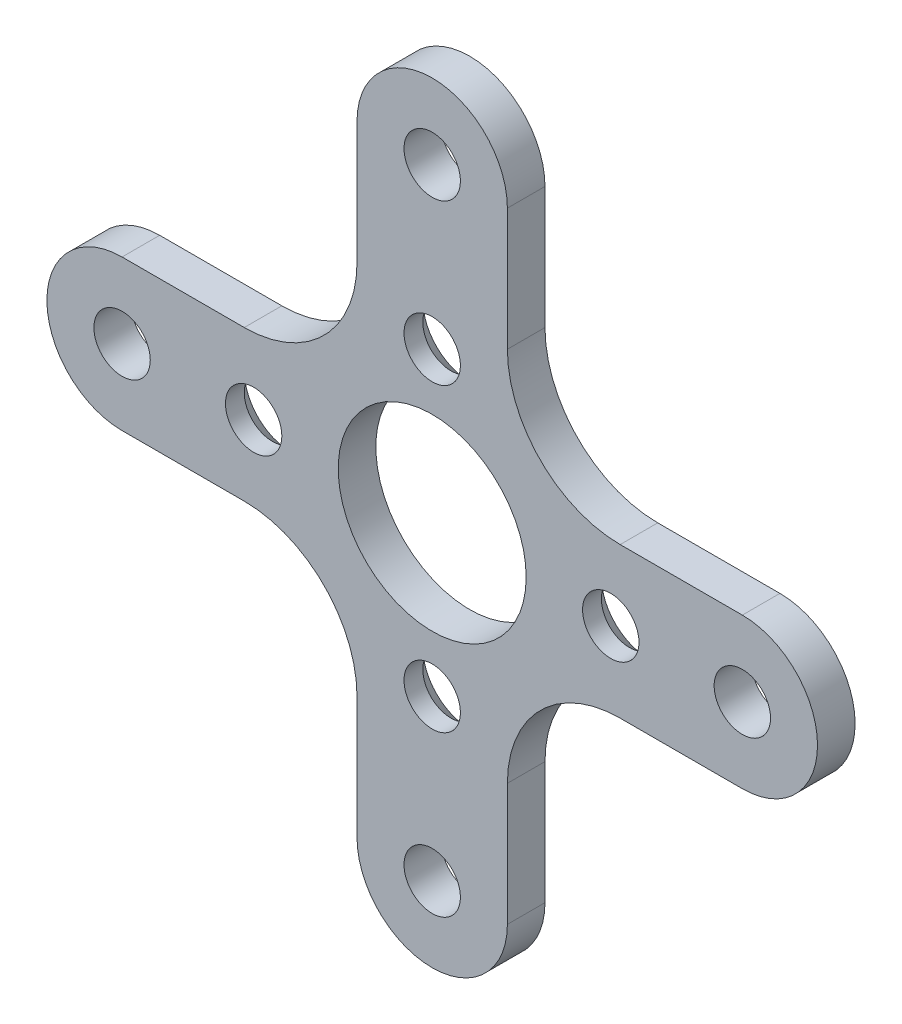
ISO-10303-21;
HEADER;
FILE_DESCRIPTION(('STEP AP214'),'2;1');
FILE_NAME('part.step','',(''),(''),'','','');
FILE_SCHEMA(('AUTOMOTIVE_DESIGN { 1 0 10303 214 1 1 1 1 }'));
ENDSEC;
DATA;
#1=APPLICATION_CONTEXT('core data for automotive mechanical design processes');
#2=APPLICATION_PROTOCOL_DEFINITION('international standard','automotive_design',2000,#1);
#3=PRODUCT_CONTEXT('',#1,'mechanical');
#4=PRODUCT('Part','Part','',(#3));
#5=PRODUCT_RELATED_PRODUCT_CATEGORY('part','',(#4));
#6=PRODUCT_DEFINITION_FORMATION('','',#4);
#7=PRODUCT_DEFINITION_CONTEXT('part definition',#1,'design');
#8=PRODUCT_DEFINITION('design','',#6,#7);
#9=PRODUCT_DEFINITION_SHAPE('','',#8);
#10=(LENGTH_UNIT() NAMED_UNIT(*) SI_UNIT(.MILLI.,.METRE.));
#11=(NAMED_UNIT(*) PLANE_ANGLE_UNIT() SI_UNIT($,.RADIAN.));
#12=(NAMED_UNIT(*) SI_UNIT($,.STERADIAN.) SOLID_ANGLE_UNIT());
#13=UNCERTAINTY_MEASURE_WITH_UNIT(LENGTH_MEASURE(1.E-05),#10,'distance_accuracy_value','');
#14=(GEOMETRIC_REPRESENTATION_CONTEXT(3) GLOBAL_UNCERTAINTY_ASSIGNED_CONTEXT((#13)) GLOBAL_UNIT_ASSIGNED_CONTEXT((#10,
#11,#12)) REPRESENTATION_CONTEXT('',''));
#15=CARTESIAN_POINT('',(0.,0.,0.));
#16=DIRECTION('',(0.,0.,1.));
#17=DIRECTION('',(1.,0.,0.));
#18=AXIS2_PLACEMENT_3D('',#15,#16,#17);
#19=CARTESIAN_POINT('',(0.,16.5,2.));
#20=DIRECTION('',(0.,0.,1.));
#21=DIRECTION('',(1.,0.,0.));
#22=AXIS2_PLACEMENT_3D('',#19,#20,#21);
#23=PLANE('',#22);
#24=CARTESIAN_POINT('',(0.,0.,2.));
#25=DIRECTION('',(0.,0.,1.));
#26=DIRECTION('',(1.,0.,0.));
#27=AXIS2_PLACEMENT_3D('',#24,#25,#26);
#28=CIRCLE('',#27,5.);
#29=CARTESIAN_POINT('',(5.,0.,2.));
#30=VERTEX_POINT('',#29);
#31=EDGE_CURVE('E318',#30,#30,#28,.T.);
#32=ORIENTED_EDGE('',*,*,#31,.F.);
#33=EDGE_LOOP('',(#32));
#34=FACE_BOUND('',#33,.T.);
#35=CARTESIAN_POINT('',(6.94421116492479E-07,-16.5000006944211,2.));
#36=DIRECTION('',(0.,0.,1.));
#37=DIRECTION('',(1.,0.,0.));
#38=AXIS2_PLACEMENT_3D('',#35,#36,#37);
#39=CIRCLE('',#38,1.5);
#40=CARTESIAN_POINT('',(1.50000069442112,-16.5000006944211,2.));
#41=VERTEX_POINT('',#40);
#42=EDGE_CURVE('E325',#41,#41,#39,.T.);
#43=ORIENTED_EDGE('',*,*,#42,.F.);
#44=EDGE_LOOP('',(#43));
#45=FACE_BOUND('',#44,.T.);
#46=CARTESIAN_POINT('',(6.94421115451529E-07,-8.00000069442111,2.));
#47=DIRECTION('',(0.,0.,1.));
#48=DIRECTION('',(1.,0.,0.));
#49=AXIS2_PLACEMENT_3D('',#46,#47,#48);
#50=CIRCLE('',#49,1.5);
#51=CARTESIAN_POINT('',(1.50000069442112,-8.00000069442111,2.));
#52=VERTEX_POINT('',#51);
#53=EDGE_CURVE('E332',#52,#52,#50,.T.);
#54=ORIENTED_EDGE('',*,*,#53,.F.);
#55=EDGE_LOOP('',(#54));
#56=FACE_BOUND('',#55,.T.);
#57=CARTESIAN_POINT('',(9.5,-6.94421114038756E-07,2.));
#58=DIRECTION('',(0.,0.,1.));
#59=DIRECTION('',(1.,0.,0.));
#60=AXIS2_PLACEMENT_3D('',#57,#58,#59);
#61=CIRCLE('',#60,1.5);
#62=CARTESIAN_POINT('',(11.,-6.94421114038756E-07,2.));
#63=VERTEX_POINT('',#62);
#64=EDGE_CURVE('E339',#63,#63,#61,.T.);
#65=ORIENTED_EDGE('',*,*,#64,.F.);
#66=EDGE_LOOP('',(#65));
#67=FACE_BOUND('',#66,.T.);
#68=CARTESIAN_POINT('',(0.,16.5,2.));
#69=DIRECTION('',(0.,0.,1.));
#70=DIRECTION('',(1.,0.,0.));
#71=AXIS2_PLACEMENT_3D('',#68,#69,#70);
#72=CIRCLE('',#71,4.);
#73=CARTESIAN_POINT('',(4.,16.5,2.));
#74=VERTEX_POINT('',#73);
#75=CARTESIAN_POINT('',(-4.,16.5,2.));
#76=VERTEX_POINT('',#75);
#77=EDGE_CURVE('E215',#74,#76,#72,.T.);
#78=ORIENTED_EDGE('',*,*,#77,.T.);
#79=DIRECTION('',(0.,-1.,0.));
#80=VECTOR('',#79,1.);
#81=CARTESIAN_POINT('',(-4.,10.,2.));
#82=LINE('',#81,#80);
#83=CARTESIAN_POINT('',(-4.,10.,2.));
#84=VERTEX_POINT('',#83);
#85=EDGE_CURVE('E123',#76,#84,#82,.T.);
#86=ORIENTED_EDGE('',*,*,#85,.T.);
#87=CARTESIAN_POINT('',(-10.,9.99999930557889,2.));
#88=DIRECTION('',(0.,0.,-1.));
#89=DIRECTION('',(1.,0.,0.));
#90=AXIS2_PLACEMENT_3D('',#87,#88,#89);
#91=CIRCLE('',#90,6.00000000000002);
#92=CARTESIAN_POINT('',(-10.,3.99999930557887,2.));
#93=VERTEX_POINT('',#92);
#94=EDGE_CURVE('E347',#84,#93,#91,.T.);
#95=ORIENTED_EDGE('',*,*,#94,.T.);
#96=DIRECTION('',(-1.,0.,0.));
#97=VECTOR('',#96,1.);
#98=CARTESIAN_POINT('',(-10.,3.99999930557889,2.));
#99=LINE('',#98,#97);
#100=CARTESIAN_POINT('',(-16.5,3.99999930557889,2.));
#101=VERTEX_POINT('',#100);
#102=EDGE_CURVE('E349',#93,#101,#99,.T.);
#103=ORIENTED_EDGE('',*,*,#102,.T.);
#104=CARTESIAN_POINT('',(-16.5,-6.94421114040816E-07,2.));
#105=DIRECTION('',(0.,0.,1.));
#106=DIRECTION('',(1.,0.,0.));
#107=AXIS2_PLACEMENT_3D('',#104,#105,#106);
#108=CIRCLE('',#107,4.);
#109=CARTESIAN_POINT('',(-16.5,-4.00000069442111,2.));
#110=VERTEX_POINT('',#109);
#111=EDGE_CURVE('E351',#101,#110,#108,.T.);
#112=ORIENTED_EDGE('',*,*,#111,.T.);
#113=DIRECTION('',(1.,0.,0.));
#114=VECTOR('',#113,1.);
#115=CARTESIAN_POINT('',(-10.,-4.00000069442111,2.));
#116=LINE('',#115,#114);
#117=CARTESIAN_POINT('',(-10.,-4.00000069442111,2.));
#118=VERTEX_POINT('',#117);
#119=EDGE_CURVE('E353',#110,#118,#116,.T.);
#120=ORIENTED_EDGE('',*,*,#119,.T.);
#121=CARTESIAN_POINT('',(-9.99999930557889,-10.0000006944211,2.));
#122=DIRECTION('',(0.,0.,-1.));
#123=DIRECTION('',(1.,0.,0.));
#124=AXIS2_PLACEMENT_3D('',#121,#122,#123);
#125=CIRCLE('',#124,6.00000000000002);
#126=CARTESIAN_POINT('',(-3.99999930557887,-10.0000006944211,2.));
#127=VERTEX_POINT('',#126);
#128=EDGE_CURVE('E355',#118,#127,#125,.T.);
#129=ORIENTED_EDGE('',*,*,#128,.T.);
#130=DIRECTION('',(0.,-1.,0.));
#131=VECTOR('',#130,1.);
#132=CARTESIAN_POINT('',(-3.99999930557889,-10.0000006944211,2.));
#133=LINE('',#132,#131);
#134=CARTESIAN_POINT('',(-3.99999930557888,-16.5000006944211,2.));
#135=VERTEX_POINT('',#134);
#136=EDGE_CURVE('E357',#127,#135,#133,.T.);
#137=ORIENTED_EDGE('',*,*,#136,.T.);
#138=CARTESIAN_POINT('',(6.94421116492479E-07,-16.5000006944211,2.));
#139=DIRECTION('',(0.,0.,1.));
#140=DIRECTION('',(1.,0.,0.));
#141=AXIS2_PLACEMENT_3D('',#138,#139,#140);
#142=CIRCLE('',#141,4.);
#143=CARTESIAN_POINT('',(4.00000069442112,-16.5000006944211,2.));
#144=VERTEX_POINT('',#143);
#145=EDGE_CURVE('E359',#135,#144,#142,.T.);
#146=ORIENTED_EDGE('',*,*,#145,.T.);
#147=DIRECTION('',(0.,1.,0.));
#148=VECTOR('',#147,1.);
#149=CARTESIAN_POINT('',(4.00000069442113,-10.0000006944211,2.));
#150=LINE('',#149,#148);
#151=CARTESIAN_POINT('',(4.00000069442113,-10.0000006944211,2.));
#152=VERTEX_POINT('',#151);
#153=EDGE_CURVE('E361',#144,#152,#150,.T.);
#154=ORIENTED_EDGE('',*,*,#153,.T.);
#155=CARTESIAN_POINT('',(10.0000006944211,-10.,2.));
#156=DIRECTION('',(0.,0.,-1.));
#157=DIRECTION('',(1.,0.,0.));
#158=AXIS2_PLACEMENT_3D('',#155,#156,#157);
#159=CIRCLE('',#158,6.00000000000002);
#160=CARTESIAN_POINT('',(10.0000006944211,-3.99999999999998,2.));
#161=VERTEX_POINT('',#160);
#162=EDGE_CURVE('E363',#152,#161,#159,.T.);
#163=ORIENTED_EDGE('',*,*,#162,.T.);
#164=DIRECTION('',(1.,0.,0.));
#165=VECTOR('',#164,1.);
#166=CARTESIAN_POINT('',(10.0000006944211,-4.,2.));
#167=LINE('',#166,#165);
#168=CARTESIAN_POINT('',(16.5000006944211,-4.,2.));
#169=VERTEX_POINT('',#168);
#170=EDGE_CURVE('E365',#161,#169,#167,.T.);
#171=ORIENTED_EDGE('',*,*,#170,.T.);
#172=CARTESIAN_POINT('',(16.5000003472106,0.,2.));
#173=DIRECTION('',(0.,0.,1.));
#174=DIRECTION('',(1.,0.,0.));
#175=AXIS2_PLACEMENT_3D('',#172,#173,#174);
#176=CIRCLE('',#175,4.00000000000002);
#177=CARTESIAN_POINT('',(16.5,4.00000000000001,2.));
#178=VERTEX_POINT('',#177);
#179=EDGE_CURVE('E166',#169,#178,#176,.T.);
#180=ORIENTED_EDGE('',*,*,#179,.T.);
#181=DIRECTION('',(-1.,0.,0.));
#182=VECTOR('',#181,1.);
#183=CARTESIAN_POINT('',(10.,4.00000000000001,2.));
#184=LINE('',#183,#182);
#185=CARTESIAN_POINT('',(10.,4.00000000000001,2.));
#186=VERTEX_POINT('',#185);
#187=EDGE_CURVE('E160',#178,#186,#184,.T.);
#188=ORIENTED_EDGE('',*,*,#187,.T.);
#189=CARTESIAN_POINT('',(10.,10.,2.));
#190=DIRECTION('',(0.,0.,-1.));
#191=DIRECTION('',(1.,0.,0.));
#192=AXIS2_PLACEMENT_3D('',#189,#190,#191);
#193=CIRCLE('',#192,6.);
#194=CARTESIAN_POINT('',(4.,10.,2.));
#195=VERTEX_POINT('',#194);
#196=EDGE_CURVE('E164',#186,#195,#193,.T.);
#197=ORIENTED_EDGE('',*,*,#196,.T.);
#198=DIRECTION('',(0.,1.,0.));
#199=VECTOR('',#198,1.);
#200=CARTESIAN_POINT('',(4.,10.,2.));
#201=LINE('',#200,#199);
#202=EDGE_CURVE('E55',#195,#74,#201,.T.);
#203=ORIENTED_EDGE('',*,*,#202,.T.);
#204=EDGE_LOOP('',(#78,#86,#95,#103,#112,#120,#129,#137,#146,#154,#163,#171,#180,#188,#197,#203));
#205=FACE_BOUND('',#204,.T.);
#206=CARTESIAN_POINT('',(0.,8.,2.));
#207=DIRECTION('',(0.,0.,1.));
#208=DIRECTION('',(1.,0.,0.));
#209=AXIS2_PLACEMENT_3D('',#206,#207,#208);
#210=CIRCLE('',#209,1.5);
#211=CARTESIAN_POINT('',(1.5,8.,2.));
#212=VERTEX_POINT('',#211);
#213=EDGE_CURVE('E188',#212,#212,#210,.T.);
#214=ORIENTED_EDGE('',*,*,#213,.F.);
#215=EDGE_LOOP('',(#214));
#216=FACE_BOUND('',#215,.T.);
#217=CARTESIAN_POINT('',(16.5000003472106,0.,2.));
#218=DIRECTION('',(0.,0.,1.));
#219=DIRECTION('',(1.,0.,0.));
#220=AXIS2_PLACEMENT_3D('',#217,#218,#219);
#221=CIRCLE('',#220,1.5);
#222=CARTESIAN_POINT('',(18.0000003472106,0.,2.));
#223=VERTEX_POINT('',#222);
#224=EDGE_CURVE('E336',#223,#223,#221,.T.);
#225=ORIENTED_EDGE('',*,*,#224,.F.);
#226=EDGE_LOOP('',(#225));
#227=FACE_BOUND('',#226,.T.);
#228=CARTESIAN_POINT('',(0.,16.5,2.));
#229=DIRECTION('',(0.,0.,1.));
#230=DIRECTION('',(1.,0.,0.));
#231=AXIS2_PLACEMENT_3D('',#228,#229,#230);
#232=CIRCLE('',#231,1.5);
#233=CARTESIAN_POINT('',(1.5,16.5,2.));
#234=VERTEX_POINT('',#233);
#235=EDGE_CURVE('E329',#234,#234,#232,.T.);
#236=ORIENTED_EDGE('',*,*,#235,.F.);
#237=EDGE_LOOP('',(#236));
#238=FACE_BOUND('',#237,.T.);
#239=CARTESIAN_POINT('',(-9.5,-6.94421114038756E-07,2.));
#240=DIRECTION('',(0.,0.,1.));
#241=DIRECTION('',(1.,0.,0.));
#242=AXIS2_PLACEMENT_3D('',#239,#240,#241);
#243=CIRCLE('',#242,1.5);
#244=CARTESIAN_POINT('',(-8.,-6.94421114038756E-07,2.));
#245=VERTEX_POINT('',#244);
#246=EDGE_CURVE('E321',#245,#245,#243,.T.);
#247=ORIENTED_EDGE('',*,*,#246,.F.);
#248=EDGE_LOOP('',(#247));
#249=FACE_BOUND('',#248,.T.);
#250=CARTESIAN_POINT('',(-16.5,-6.94421114040816E-07,2.));
#251=DIRECTION('',(0.,0.,1.));
#252=DIRECTION('',(1.,0.,0.));
#253=AXIS2_PLACEMENT_3D('',#250,#251,#252);
#254=CIRCLE('',#253,1.5);
#255=CARTESIAN_POINT('',(-15.,-6.94421114040816E-07,2.));
#256=VERTEX_POINT('',#255);
#257=EDGE_CURVE('E313',#256,#256,#254,.T.);
#258=ORIENTED_EDGE('',*,*,#257,.F.);
#259=EDGE_LOOP('',(#258));
#260=FACE_BOUND('',#259,.T.);
#261=ADVANCED_FACE('F37',(#34,#45,#56,#67,#205,#216,#227,#238,#249,#260),#23,.T.);
#262=CARTESIAN_POINT('',(0.,16.5,0.));
#263=DIRECTION('',(0.,0.,1.));
#264=DIRECTION('',(1.,0.,0.));
#265=AXIS2_PLACEMENT_3D('',#262,#263,#264);
#266=PLANE('',#265);
#267=CARTESIAN_POINT('',(6.94421115451529E-07,-8.00000069442111,0.));
#268=DIRECTION('',(0.,0.,1.));
#269=DIRECTION('',(1.,0.,0.));
#270=AXIS2_PLACEMENT_3D('',#267,#268,#269);
#271=CIRCLE('',#270,2.5);
#272=CARTESIAN_POINT('',(2.50000069442111,-8.00000069442111,0.));
#273=VERTEX_POINT('',#272);
#274=EDGE_CURVE('E263',#273,#273,#271,.T.);
#275=ORIENTED_EDGE('',*,*,#274,.T.);
#276=EDGE_LOOP('',(#275));
#277=FACE_BOUND('',#276,.T.);
#278=CARTESIAN_POINT('',(-9.5,-6.94421114038756E-07,0.));
#279=DIRECTION('',(0.,0.,1.));
#280=DIRECTION('',(1.,0.,0.));
#281=AXIS2_PLACEMENT_3D('',#278,#279,#280);
#282=CIRCLE('',#281,2.5);
#283=CARTESIAN_POINT('',(-7.,-6.94421114038756E-07,0.));
#284=VERTEX_POINT('',#283);
#285=EDGE_CURVE('E260',#284,#284,#282,.T.);
#286=ORIENTED_EDGE('',*,*,#285,.T.);
#287=EDGE_LOOP('',(#286));
#288=FACE_BOUND('',#287,.T.);
#289=CARTESIAN_POINT('',(0.,8.,0.));
#290=DIRECTION('',(0.,0.,1.));
#291=DIRECTION('',(1.,0.,0.));
#292=AXIS2_PLACEMENT_3D('',#289,#290,#291);
#293=CIRCLE('',#292,2.5);
#294=CARTESIAN_POINT('',(2.5,8.,0.));
#295=VERTEX_POINT('',#294);
#296=EDGE_CURVE('E257',#295,#295,#293,.T.);
#297=ORIENTED_EDGE('',*,*,#296,.T.);
#298=EDGE_LOOP('',(#297));
#299=FACE_BOUND('',#298,.T.);
#300=CARTESIAN_POINT('',(9.5,-6.94421114038756E-07,0.));
#301=DIRECTION('',(0.,0.,1.));
#302=DIRECTION('',(1.,0.,0.));
#303=AXIS2_PLACEMENT_3D('',#300,#301,#302);
#304=CIRCLE('',#303,2.5);
#305=CARTESIAN_POINT('',(12.,-6.94421114038756E-07,0.));
#306=VERTEX_POINT('',#305);
#307=EDGE_CURVE('E254',#306,#306,#304,.T.);
#308=ORIENTED_EDGE('',*,*,#307,.T.);
#309=EDGE_LOOP('',(#308));
#310=FACE_BOUND('',#309,.T.);
#311=CARTESIAN_POINT('',(0.,16.5,0.));
#312=DIRECTION('',(0.,0.,1.));
#313=DIRECTION('',(1.,0.,0.));
#314=AXIS2_PLACEMENT_3D('',#311,#312,#313);
#315=CIRCLE('',#314,4.);
#316=CARTESIAN_POINT('',(4.,16.5,0.));
#317=VERTEX_POINT('',#316);
#318=CARTESIAN_POINT('',(-4.,16.5,0.));
#319=VERTEX_POINT('',#318);
#320=EDGE_CURVE('E184',#317,#319,#315,.T.);
#321=ORIENTED_EDGE('',*,*,#320,.F.);
#322=DIRECTION('',(0.,1.,0.));
#323=VECTOR('',#322,1.);
#324=CARTESIAN_POINT('',(4.,10.,0.));
#325=LINE('',#324,#323);
#326=CARTESIAN_POINT('',(4.,10.,0.));
#327=VERTEX_POINT('',#326);
#328=EDGE_CURVE('E114',#327,#317,#325,.T.);
#329=ORIENTED_EDGE('',*,*,#328,.F.);
#330=CARTESIAN_POINT('',(10.,10.,0.));
#331=DIRECTION('',(0.,0.,-1.));
#332=DIRECTION('',(1.,0.,0.));
#333=AXIS2_PLACEMENT_3D('',#330,#331,#332);
#334=CIRCLE('',#333,6.);
#335=CARTESIAN_POINT('',(10.,4.00000000000001,0.));
#336=VERTEX_POINT('',#335);
#337=EDGE_CURVE('E108',#336,#327,#334,.T.);
#338=ORIENTED_EDGE('',*,*,#337,.F.);
#339=DIRECTION('',(-1.,0.,0.));
#340=VECTOR('',#339,1.);
#341=CARTESIAN_POINT('',(10.,4.00000000000001,0.));
#342=LINE('',#341,#340);
#343=CARTESIAN_POINT('',(16.5,4.00000000000001,0.));
#344=VERTEX_POINT('',#343);
#345=EDGE_CURVE('E174',#344,#336,#342,.T.);
#346=ORIENTED_EDGE('',*,*,#345,.F.);
#347=CARTESIAN_POINT('',(16.5000003472106,0.,0.));
#348=DIRECTION('',(0.,0.,1.));
#349=DIRECTION('',(1.,0.,0.));
#350=AXIS2_PLACEMENT_3D('',#347,#348,#349);
#351=CIRCLE('',#350,4.00000000000002);
#352=CARTESIAN_POINT('',(16.5000006944211,-4.,0.));
#353=VERTEX_POINT('',#352);
#354=EDGE_CURVE('E210',#353,#344,#351,.T.);
#355=ORIENTED_EDGE('',*,*,#354,.F.);
#356=DIRECTION('',(1.,0.,0.));
#357=VECTOR('',#356,1.);
#358=CARTESIAN_POINT('',(10.0000006944211,-4.,0.));
#359=LINE('',#358,#357);
#360=CARTESIAN_POINT('',(10.0000006944211,-3.99999999999998,0.));
#361=VERTEX_POINT('',#360);
#362=EDGE_CURVE('E208',#361,#353,#359,.T.);
#363=ORIENTED_EDGE('',*,*,#362,.F.);
#364=CARTESIAN_POINT('',(10.0000006944211,-10.,0.));
#365=DIRECTION('',(0.,0.,-1.));
#366=DIRECTION('',(1.,0.,0.));
#367=AXIS2_PLACEMENT_3D('',#364,#365,#366);
#368=CIRCLE('',#367,6.00000000000002);
#369=CARTESIAN_POINT('',(4.00000069442113,-10.0000006944211,0.));
#370=VERTEX_POINT('',#369);
#371=EDGE_CURVE('E206',#370,#361,#368,.T.);
#372=ORIENTED_EDGE('',*,*,#371,.F.);
#373=DIRECTION('',(0.,1.,0.));
#374=VECTOR('',#373,1.);
#375=CARTESIAN_POINT('',(4.00000069442113,-10.0000006944211,0.));
#376=LINE('',#375,#374);
#377=CARTESIAN_POINT('',(4.00000069442112,-16.5000006944211,0.));
#378=VERTEX_POINT('',#377);
#379=EDGE_CURVE('E204',#378,#370,#376,.T.);
#380=ORIENTED_EDGE('',*,*,#379,.F.);
#381=CARTESIAN_POINT('',(6.94421116492479E-07,-16.5000006944211,0.));
#382=DIRECTION('',(0.,0.,1.));
#383=DIRECTION('',(1.,0.,0.));
#384=AXIS2_PLACEMENT_3D('',#381,#382,#383);
#385=CIRCLE('',#384,4.);
#386=CARTESIAN_POINT('',(-3.99999930557888,-16.5000006944211,0.));
#387=VERTEX_POINT('',#386);
#388=EDGE_CURVE('E202',#387,#378,#385,.T.);
#389=ORIENTED_EDGE('',*,*,#388,.F.);
#390=DIRECTION('',(0.,-1.,0.));
#391=VECTOR('',#390,1.);
#392=CARTESIAN_POINT('',(-3.99999930557889,-10.0000006944211,0.));
#393=LINE('',#392,#391);
#394=CARTESIAN_POINT('',(-3.99999930557887,-10.0000006944211,0.));
#395=VERTEX_POINT('',#394);
#396=EDGE_CURVE('E200',#395,#387,#393,.T.);
#397=ORIENTED_EDGE('',*,*,#396,.F.);
#398=CARTESIAN_POINT('',(-9.99999930557889,-10.0000006944211,0.));
#399=DIRECTION('',(0.,0.,-1.));
#400=DIRECTION('',(1.,0.,0.));
#401=AXIS2_PLACEMENT_3D('',#398,#399,#400);
#402=CIRCLE('',#401,6.00000000000002);
#403=CARTESIAN_POINT('',(-10.,-4.00000069442111,0.));
#404=VERTEX_POINT('',#403);
#405=EDGE_CURVE('E198',#404,#395,#402,.T.);
#406=ORIENTED_EDGE('',*,*,#405,.F.);
#407=DIRECTION('',(1.,0.,0.));
#408=VECTOR('',#407,1.);
#409=CARTESIAN_POINT('',(-10.,-4.00000069442111,0.));
#410=LINE('',#409,#408);
#411=CARTESIAN_POINT('',(-16.5,-4.00000069442111,0.));
#412=VERTEX_POINT('',#411);
#413=EDGE_CURVE('E196',#412,#404,#410,.T.);
#414=ORIENTED_EDGE('',*,*,#413,.F.);
#415=CARTESIAN_POINT('',(-16.5,-6.94421114040816E-07,0.));
#416=DIRECTION('',(0.,0.,1.));
#417=DIRECTION('',(1.,0.,0.));
#418=AXIS2_PLACEMENT_3D('',#415,#416,#417);
#419=CIRCLE('',#418,4.);
#420=CARTESIAN_POINT('',(-16.5,3.99999930557889,0.));
#421=VERTEX_POINT('',#420);
#422=EDGE_CURVE('E194',#421,#412,#419,.T.);
#423=ORIENTED_EDGE('',*,*,#422,.F.);
#424=DIRECTION('',(-1.,0.,0.));
#425=VECTOR('',#424,1.);
#426=CARTESIAN_POINT('',(-10.,3.99999930557889,0.));
#427=LINE('',#426,#425);
#428=CARTESIAN_POINT('',(-10.,3.99999930557887,0.));
#429=VERTEX_POINT('',#428);
#430=EDGE_CURVE('E192',#429,#421,#427,.T.);
#431=ORIENTED_EDGE('',*,*,#430,.F.);
#432=CARTESIAN_POINT('',(-10.,9.99999930557889,0.));
#433=DIRECTION('',(0.,0.,-1.));
#434=DIRECTION('',(1.,0.,0.));
#435=AXIS2_PLACEMENT_3D('',#432,#433,#434);
#436=CIRCLE('',#435,6.00000000000002);
#437=CARTESIAN_POINT('',(-4.,10.,0.));
#438=VERTEX_POINT('',#437);
#439=EDGE_CURVE('E190',#438,#429,#436,.T.);
#440=ORIENTED_EDGE('',*,*,#439,.F.);
#441=DIRECTION('',(0.,-1.,0.));
#442=VECTOR('',#441,1.);
#443=CARTESIAN_POINT('',(-4.,10.,0.));
#444=LINE('',#443,#442);
#445=EDGE_CURVE('E187',#319,#438,#444,.T.);
#446=ORIENTED_EDGE('',*,*,#445,.F.);
#447=EDGE_LOOP('',(#321,#329,#338,#346,#355,#363,#372,#380,#389,#397,#406,#414,#423,#431,#440,#446));
#448=FACE_BOUND('',#447,.T.);
#449=CARTESIAN_POINT('',(16.5000003472106,0.,0.));
#450=DIRECTION('',(0.,0.,1.));
#451=DIRECTION('',(1.,0.,0.));
#452=AXIS2_PLACEMENT_3D('',#449,#450,#451);
#453=CIRCLE('',#452,1.5);
#454=CARTESIAN_POINT('',(18.0000003472106,0.,0.));
#455=VERTEX_POINT('',#454);
#456=EDGE_CURVE('E296',#455,#455,#453,.T.);
#457=ORIENTED_EDGE('',*,*,#456,.T.);
#458=EDGE_LOOP('',(#457));
#459=FACE_BOUND('',#458,.T.);
#460=CARTESIAN_POINT('',(0.,16.5,0.));
#461=DIRECTION('',(0.,0.,1.));
#462=DIRECTION('',(1.,0.,0.));
#463=AXIS2_PLACEMENT_3D('',#460,#461,#462);
#464=CIRCLE('',#463,1.5);
#465=CARTESIAN_POINT('',(1.5,16.5,0.));
#466=VERTEX_POINT('',#465);
#467=EDGE_CURVE('E300',#466,#466,#464,.T.);
#468=ORIENTED_EDGE('',*,*,#467,.T.);
#469=EDGE_LOOP('',(#468));
#470=FACE_BOUND('',#469,.T.);
#471=CARTESIAN_POINT('',(6.94421116492479E-07,-16.5000006944211,0.));
#472=DIRECTION('',(0.,0.,1.));
#473=DIRECTION('',(1.,0.,0.));
#474=AXIS2_PLACEMENT_3D('',#471,#472,#473);
#475=CIRCLE('',#474,1.5);
#476=CARTESIAN_POINT('',(1.50000069442112,-16.5000006944211,0.));
#477=VERTEX_POINT('',#476);
#478=EDGE_CURVE('E304',#477,#477,#475,.T.);
#479=ORIENTED_EDGE('',*,*,#478,.T.);
#480=EDGE_LOOP('',(#479));
#481=FACE_BOUND('',#480,.T.);
#482=CARTESIAN_POINT('',(0.,0.,0.));
#483=DIRECTION('',(0.,0.,1.));
#484=DIRECTION('',(1.,0.,0.));
#485=AXIS2_PLACEMENT_3D('',#482,#483,#484);
#486=CIRCLE('',#485,5.);
#487=CARTESIAN_POINT('',(5.,0.,0.));
#488=VERTEX_POINT('',#487);
#489=EDGE_CURVE('E308',#488,#488,#486,.T.);
#490=ORIENTED_EDGE('',*,*,#489,.T.);
#491=EDGE_LOOP('',(#490));
#492=FACE_BOUND('',#491,.T.);
#493=CARTESIAN_POINT('',(-16.5,-6.94421114040816E-07,0.));
#494=DIRECTION('',(0.,0.,1.));
#495=DIRECTION('',(1.,0.,0.));
#496=AXIS2_PLACEMENT_3D('',#493,#494,#495);
#497=CIRCLE('',#496,1.5);
#498=CARTESIAN_POINT('',(-15.,-6.94421114040816E-07,0.));
#499=VERTEX_POINT('',#498);
#500=EDGE_CURVE('E311',#499,#499,#497,.T.);
#501=ORIENTED_EDGE('',*,*,#500,.T.);
#502=EDGE_LOOP('',(#501));
#503=FACE_BOUND('',#502,.T.);
#504=ADVANCED_FACE('F283',(#277,#288,#299,#310,#448,#459,#470,#481,#492,#503),#266,.F.);
#505=CARTESIAN_POINT('',(0.,16.5,2.));
#506=DIRECTION('',(0.,0.,-1.));
#507=DIRECTION('',(-1.,0.,0.));
#508=AXIS2_PLACEMENT_3D('',#505,#506,#507);
#509=CYLINDRICAL_SURFACE('',#508,4.);
#510=ORIENTED_EDGE('',*,*,#320,.T.);
#511=DIRECTION('',(0.,0.,-1.));
#512=VECTOR('',#511,1.);
#513=CARTESIAN_POINT('',(-4.,16.5,2.));
#514=LINE('',#513,#512);
#515=EDGE_CURVE('E252',#76,#319,#514,.T.);
#516=ORIENTED_EDGE('',*,*,#515,.F.);
#517=ORIENTED_EDGE('',*,*,#77,.F.);
#518=DIRECTION('',(0.,0.,-1.));
#519=VECTOR('',#518,1.);
#520=CARTESIAN_POINT('',(4.,16.5,2.));
#521=LINE('',#520,#519);
#522=EDGE_CURVE('E180',#74,#317,#521,.T.);
#523=ORIENTED_EDGE('',*,*,#522,.T.);
#524=EDGE_LOOP('',(#510,#516,#517,#523));
#525=FACE_BOUND('',#524,.T.);
#526=ADVANCED_FACE('F286',(#525),#509,.T.);
#527=CARTESIAN_POINT('',(-4.,10.,2.));
#528=DIRECTION('',(1.,0.,0.));
#529=DIRECTION('',(0.,1.,0.));
#530=AXIS2_PLACEMENT_3D('',#527,#528,#529);
#531=PLANE('',#530);
#532=ORIENTED_EDGE('',*,*,#445,.T.);
#533=DIRECTION('',(0.,0.,-1.));
#534=VECTOR('',#533,1.);
#535=CARTESIAN_POINT('',(-4.,10.,2.));
#536=LINE('',#535,#534);
#537=EDGE_CURVE('E249',#84,#438,#536,.T.);
#538=ORIENTED_EDGE('',*,*,#537,.F.);
#539=ORIENTED_EDGE('',*,*,#85,.F.);
#540=ORIENTED_EDGE('',*,*,#515,.T.);
#541=EDGE_LOOP('',(#532,#538,#539,#540));
#542=FACE_BOUND('',#541,.T.);
#543=ADVANCED_FACE('F420',(#542),#531,.F.);
#544=CARTESIAN_POINT('',(-10.,9.99999930557889,2.));
#545=DIRECTION('',(0.,0.,-1.));
#546=DIRECTION('',(-1.,0.,0.));
#547=AXIS2_PLACEMENT_3D('',#544,#545,#546);
#548=CYLINDRICAL_SURFACE('',#547,6.00000000000002);
#549=ORIENTED_EDGE('',*,*,#439,.T.);
#550=DIRECTION('',(0.,0.,-1.));
#551=VECTOR('',#550,1.);
#552=CARTESIAN_POINT('',(-10.,3.99999930557887,2.));
#553=LINE('',#552,#551);
#554=EDGE_CURVE('E246',#93,#429,#553,.T.);
#555=ORIENTED_EDGE('',*,*,#554,.F.);
#556=ORIENTED_EDGE('',*,*,#94,.F.);
#557=ORIENTED_EDGE('',*,*,#537,.T.);
#558=EDGE_LOOP('',(#549,#555,#556,#557));
#559=FACE_BOUND('',#558,.T.);
#560=ADVANCED_FACE('F418',(#559),#548,.F.);
#561=CARTESIAN_POINT('',(-10.,3.99999930557889,2.));
#562=DIRECTION('',(0.,-1.,0.));
#563=DIRECTION('',(1.,0.,0.));
#564=AXIS2_PLACEMENT_3D('',#561,#562,#563);
#565=PLANE('',#564);
#566=ORIENTED_EDGE('',*,*,#430,.T.);
#567=DIRECTION('',(0.,0.,-1.));
#568=VECTOR('',#567,1.);
#569=CARTESIAN_POINT('',(-16.5,3.99999930557889,2.));
#570=LINE('',#569,#568);
#571=EDGE_CURVE('E243',#101,#421,#570,.T.);
#572=ORIENTED_EDGE('',*,*,#571,.F.);
#573=ORIENTED_EDGE('',*,*,#102,.F.);
#574=ORIENTED_EDGE('',*,*,#554,.T.);
#575=EDGE_LOOP('',(#566,#572,#573,#574));
#576=FACE_BOUND('',#575,.T.);
#577=ADVANCED_FACE('F414',(#576),#565,.F.);
#578=CARTESIAN_POINT('',(-16.5,-6.94421114040816E-07,2.));
#579=DIRECTION('',(0.,0.,-1.));
#580=DIRECTION('',(-1.,0.,0.));
#581=AXIS2_PLACEMENT_3D('',#578,#579,#580);
#582=CYLINDRICAL_SURFACE('',#581,4.);
#583=ORIENTED_EDGE('',*,*,#422,.T.);
#584=DIRECTION('',(0.,0.,-1.));
#585=VECTOR('',#584,1.);
#586=CARTESIAN_POINT('',(-16.5,-4.00000069442111,2.));
#587=LINE('',#586,#585);
#588=EDGE_CURVE('E240',#110,#412,#587,.T.);
#589=ORIENTED_EDGE('',*,*,#588,.F.);
#590=ORIENTED_EDGE('',*,*,#111,.F.);
#591=ORIENTED_EDGE('',*,*,#571,.T.);
#592=EDGE_LOOP('',(#583,#589,#590,#591));
#593=FACE_BOUND('',#592,.T.);
#594=ADVANCED_FACE('F409',(#593),#582,.T.);
#595=CARTESIAN_POINT('',(-10.,-4.00000069442111,2.));
#596=DIRECTION('',(0.,1.,0.));
#597=DIRECTION('',(-1.,0.,0.));
#598=AXIS2_PLACEMENT_3D('',#595,#596,#597);
#599=PLANE('',#598);
#600=ORIENTED_EDGE('',*,*,#413,.T.);
#601=DIRECTION('',(0.,0.,-1.));
#602=VECTOR('',#601,1.);
#603=CARTESIAN_POINT('',(-10.,-4.00000069442111,2.));
#604=LINE('',#603,#602);
#605=EDGE_CURVE('E237',#118,#404,#604,.T.);
#606=ORIENTED_EDGE('',*,*,#605,.F.);
#607=ORIENTED_EDGE('',*,*,#119,.F.);
#608=ORIENTED_EDGE('',*,*,#588,.T.);
#609=EDGE_LOOP('',(#600,#606,#607,#608));
#610=FACE_BOUND('',#609,.T.);
#611=ADVANCED_FACE('F403',(#610),#599,.F.);
#612=CARTESIAN_POINT('',(-9.99999930557889,-10.0000006944211,2.));
#613=DIRECTION('',(0.,0.,-1.));
#614=DIRECTION('',(-1.,0.,0.));
#615=AXIS2_PLACEMENT_3D('',#612,#613,#614);
#616=CYLINDRICAL_SURFACE('',#615,6.00000000000002);
#617=ORIENTED_EDGE('',*,*,#405,.T.);
#618=DIRECTION('',(0.,0.,-1.));
#619=VECTOR('',#618,1.);
#620=CARTESIAN_POINT('',(-3.99999930557887,-10.0000006944211,2.));
#621=LINE('',#620,#619);
#622=EDGE_CURVE('E234',#127,#395,#621,.T.);
#623=ORIENTED_EDGE('',*,*,#622,.F.);
#624=ORIENTED_EDGE('',*,*,#128,.F.);
#625=ORIENTED_EDGE('',*,*,#605,.T.);
#626=EDGE_LOOP('',(#617,#623,#624,#625));
#627=FACE_BOUND('',#626,.T.);
#628=ADVANCED_FACE('F399',(#627),#616,.F.);
#629=CARTESIAN_POINT('',(-3.99999930557889,-10.0000006944211,2.));
#630=DIRECTION('',(1.,0.,0.));
#631=DIRECTION('',(0.,1.,0.));
#632=AXIS2_PLACEMENT_3D('',#629,#630,#631);
#633=PLANE('',#632);
#634=ORIENTED_EDGE('',*,*,#396,.T.);
#635=DIRECTION('',(0.,0.,-1.));
#636=VECTOR('',#635,1.);
#637=CARTESIAN_POINT('',(-3.99999930557888,-16.5000006944211,2.));
#638=LINE('',#637,#636);
#639=EDGE_CURVE('E231',#135,#387,#638,.T.);
#640=ORIENTED_EDGE('',*,*,#639,.F.);
#641=ORIENTED_EDGE('',*,*,#136,.F.);
#642=ORIENTED_EDGE('',*,*,#622,.T.);
#643=EDGE_LOOP('',(#634,#640,#641,#642));
#644=FACE_BOUND('',#643,.T.);
#645=ADVANCED_FACE('F394',(#644),#633,.F.);
#646=CARTESIAN_POINT('',(6.94421116492479E-07,-16.5000006944211,2.));
#647=DIRECTION('',(0.,0.,-1.));
#648=DIRECTION('',(-1.,0.,0.));
#649=AXIS2_PLACEMENT_3D('',#646,#647,#648);
#650=CYLINDRICAL_SURFACE('',#649,4.);
#651=ORIENTED_EDGE('',*,*,#388,.T.);
#652=DIRECTION('',(0.,0.,-1.));
#653=VECTOR('',#652,1.);
#654=CARTESIAN_POINT('',(4.00000069442112,-16.5000006944211,2.));
#655=LINE('',#654,#653);
#656=EDGE_CURVE('E228',#144,#378,#655,.T.);
#657=ORIENTED_EDGE('',*,*,#656,.F.);
#658=ORIENTED_EDGE('',*,*,#145,.F.);
#659=ORIENTED_EDGE('',*,*,#639,.T.);
#660=EDGE_LOOP('',(#651,#657,#658,#659));
#661=FACE_BOUND('',#660,.T.);
#662=ADVANCED_FACE('F388',(#661),#650,.T.);
#663=CARTESIAN_POINT('',(4.00000069442113,-10.0000006944211,2.));
#664=DIRECTION('',(-1.,0.,0.));
#665=DIRECTION('',(0.,-1.,0.));
#666=AXIS2_PLACEMENT_3D('',#663,#664,#665);
#667=PLANE('',#666);
#668=ORIENTED_EDGE('',*,*,#379,.T.);
#669=DIRECTION('',(0.,0.,-1.));
#670=VECTOR('',#669,1.);
#671=CARTESIAN_POINT('',(4.00000069442113,-10.0000006944211,2.));
#672=LINE('',#671,#670);
#673=EDGE_CURVE('E225',#152,#370,#672,.T.);
#674=ORIENTED_EDGE('',*,*,#673,.F.);
#675=ORIENTED_EDGE('',*,*,#153,.F.);
#676=ORIENTED_EDGE('',*,*,#656,.T.);
#677=EDGE_LOOP('',(#668,#674,#675,#676));
#678=FACE_BOUND('',#677,.T.);
#679=ADVANCED_FACE('F384',(#678),#667,.F.);
#680=CARTESIAN_POINT('',(10.0000006944211,-10.,2.));
#681=DIRECTION('',(0.,0.,-1.));
#682=DIRECTION('',(-1.,0.,0.));
#683=AXIS2_PLACEMENT_3D('',#680,#681,#682);
#684=CYLINDRICAL_SURFACE('',#683,6.00000000000002);
#685=ORIENTED_EDGE('',*,*,#371,.T.);
#686=DIRECTION('',(0.,0.,-1.));
#687=VECTOR('',#686,1.);
#688=CARTESIAN_POINT('',(10.0000006944211,-3.99999999999998,2.));
#689=LINE('',#688,#687);
#690=EDGE_CURVE('E222',#161,#361,#689,.T.);
#691=ORIENTED_EDGE('',*,*,#690,.F.);
#692=ORIENTED_EDGE('',*,*,#162,.F.);
#693=ORIENTED_EDGE('',*,*,#673,.T.);
#694=EDGE_LOOP('',(#685,#691,#692,#693));
#695=FACE_BOUND('',#694,.T.);
#696=ADVANCED_FACE('F380',(#695),#684,.F.);
#697=CARTESIAN_POINT('',(10.0000006944211,-4.,2.));
#698=DIRECTION('',(0.,1.,0.));
#699=DIRECTION('',(-1.,0.,0.));
#700=AXIS2_PLACEMENT_3D('',#697,#698,#699);
#701=PLANE('',#700);
#702=ORIENTED_EDGE('',*,*,#362,.T.);
#703=DIRECTION('',(0.,0.,-1.));
#704=VECTOR('',#703,1.);
#705=CARTESIAN_POINT('',(16.5000006944211,-4.,2.));
#706=LINE('',#705,#704);
#707=EDGE_CURVE('E219',#169,#353,#706,.T.);
#708=ORIENTED_EDGE('',*,*,#707,.F.);
#709=ORIENTED_EDGE('',*,*,#170,.F.);
#710=ORIENTED_EDGE('',*,*,#690,.T.);
#711=EDGE_LOOP('',(#702,#708,#709,#710));
#712=FACE_BOUND('',#711,.T.);
#713=ADVANCED_FACE('F371',(#712),#701,.F.);
#714=CARTESIAN_POINT('',(16.5000003472106,0.,2.));
#715=DIRECTION('',(0.,0.,-1.));
#716=DIRECTION('',(-1.,0.,0.));
#717=AXIS2_PLACEMENT_3D('',#714,#715,#716);
#718=CYLINDRICAL_SURFACE('',#717,4.00000000000002);
#719=ORIENTED_EDGE('',*,*,#354,.T.);
#720=DIRECTION('',(0.,0.,-1.));
#721=VECTOR('',#720,1.);
#722=CARTESIAN_POINT('',(16.5,4.00000000000001,2.));
#723=LINE('',#722,#721);
#724=EDGE_CURVE('E175',#178,#344,#723,.T.);
#725=ORIENTED_EDGE('',*,*,#724,.F.);
#726=ORIENTED_EDGE('',*,*,#179,.F.);
#727=ORIENTED_EDGE('',*,*,#707,.T.);
#728=EDGE_LOOP('',(#719,#725,#726,#727));
#729=FACE_BOUND('',#728,.T.);
#730=ADVANCED_FACE('F375',(#729),#718,.T.);
#731=CARTESIAN_POINT('',(10.,4.00000000000001,2.));
#732=DIRECTION('',(0.,-1.,0.));
#733=DIRECTION('',(0.,0.,-1.));
#734=AXIS2_PLACEMENT_3D('',#731,#732,#733);
#735=PLANE('',#734);
#736=ORIENTED_EDGE('',*,*,#345,.T.);
#737=DIRECTION('',(0.,0.,-1.));
#738=VECTOR('',#737,1.);
#739=CARTESIAN_POINT('',(10.,4.00000000000001,2.));
#740=LINE('',#739,#738);
#741=EDGE_CURVE('E171',#186,#336,#740,.T.);
#742=ORIENTED_EDGE('',*,*,#741,.F.);
#743=ORIENTED_EDGE('',*,*,#187,.F.);
#744=ORIENTED_EDGE('',*,*,#724,.T.);
#745=EDGE_LOOP('',(#736,#742,#743,#744));
#746=FACE_BOUND('',#745,.T.);
#747=ADVANCED_FACE('F172',(#746),#735,.F.);
#748=CARTESIAN_POINT('',(10.,10.,2.));
#749=DIRECTION('',(0.,0.,-1.));
#750=DIRECTION('',(-1.,0.,0.));
#751=AXIS2_PLACEMENT_3D('',#748,#749,#750);
#752=CYLINDRICAL_SURFACE('',#751,6.);
#753=ORIENTED_EDGE('',*,*,#337,.T.);
#754=DIRECTION('',(0.,0.,-1.));
#755=VECTOR('',#754,1.);
#756=CARTESIAN_POINT('',(4.,10.,2.));
#757=LINE('',#756,#755);
#758=EDGE_CURVE('E176',#195,#327,#757,.T.);
#759=ORIENTED_EDGE('',*,*,#758,.F.);
#760=ORIENTED_EDGE('',*,*,#196,.F.);
#761=ORIENTED_EDGE('',*,*,#741,.T.);
#762=EDGE_LOOP('',(#753,#759,#760,#761));
#763=FACE_BOUND('',#762,.T.);
#764=ADVANCED_FACE('F178',(#763),#752,.F.);
#765=CARTESIAN_POINT('',(4.,10.,2.));
#766=DIRECTION('',(-1.,0.,0.));
#767=DIRECTION('',(0.,-1.,0.));
#768=AXIS2_PLACEMENT_3D('',#765,#766,#767);
#769=PLANE('',#768);
#770=ORIENTED_EDGE('',*,*,#328,.T.);
#771=ORIENTED_EDGE('',*,*,#522,.F.);
#772=ORIENTED_EDGE('',*,*,#202,.F.);
#773=ORIENTED_EDGE('',*,*,#758,.T.);
#774=EDGE_LOOP('',(#770,#771,#772,#773));
#775=FACE_BOUND('',#774,.T.);
#776=ADVANCED_FACE('F423',(#775),#769,.F.);
#777=CARTESIAN_POINT('',(0.,8.,2.));
#778=DIRECTION('',(0.,0.,-1.));
#779=DIRECTION('',(-1.,0.,0.));
#780=AXIS2_PLACEMENT_3D('',#777,#778,#779);
#781=CYLINDRICAL_SURFACE('',#780,1.5);
#782=CARTESIAN_POINT('',(0.,8.,0.999999999999997));
#783=DIRECTION('',(0.,0.,1.));
#784=DIRECTION('',(1.,0.,0.));
#785=AXIS2_PLACEMENT_3D('',#782,#783,#784);
#786=CIRCLE('',#785,1.5);
#787=CARTESIAN_POINT('',(1.5,8.,0.999999999999997));
#788=VERTEX_POINT('',#787);
#789=EDGE_CURVE('E47',#788,#788,#786,.F.);
#790=ORIENTED_EDGE('',*,*,#789,.T.);
#791=EDGE_LOOP('',(#790));
#792=FACE_BOUND('',#791,.T.);
#793=ORIENTED_EDGE('',*,*,#213,.T.);
#794=EDGE_LOOP('',(#793));
#795=FACE_BOUND('',#794,.T.);
#796=ADVANCED_FACE('F274',(#792,#795),#781,.F.);
#797=CARTESIAN_POINT('',(9.5,-6.94421114038756E-07,2.));
#798=DIRECTION('',(0.,0.,-1.));
#799=DIRECTION('',(-1.,0.,0.));
#800=AXIS2_PLACEMENT_3D('',#797,#798,#799);
#801=CYLINDRICAL_SURFACE('',#800,1.5);
#802=CARTESIAN_POINT('',(9.5,-6.94421114038756E-07,1.));
#803=DIRECTION('',(0.,0.,1.));
#804=DIRECTION('',(1.,0.,0.));
#805=AXIS2_PLACEMENT_3D('',#802,#803,#804);
#806=CIRCLE('',#805,1.5);
#807=CARTESIAN_POINT('',(11.,-6.94421114038756E-07,1.));
#808=VERTEX_POINT('',#807);
#809=EDGE_CURVE('E11',#808,#808,#806,.F.);
#810=ORIENTED_EDGE('',*,*,#809,.T.);
#811=EDGE_LOOP('',(#810));
#812=FACE_BOUND('',#811,.T.);
#813=ORIENTED_EDGE('',*,*,#64,.T.);
#814=EDGE_LOOP('',(#813));
#815=FACE_BOUND('',#814,.T.);
#816=ADVANCED_FACE('F430',(#812,#815),#801,.F.);
#817=CARTESIAN_POINT('',(16.5000003472106,0.,2.));
#818=DIRECTION('',(0.,0.,-1.));
#819=DIRECTION('',(-1.,0.,0.));
#820=AXIS2_PLACEMENT_3D('',#817,#818,#819);
#821=CYLINDRICAL_SURFACE('',#820,1.5);
#822=ORIENTED_EDGE('',*,*,#224,.T.);
#823=EDGE_LOOP('',(#822));
#824=FACE_BOUND('',#823,.T.);
#825=ORIENTED_EDGE('',*,*,#456,.F.);
#826=EDGE_LOOP('',(#825));
#827=FACE_BOUND('',#826,.T.);
#828=ADVANCED_FACE('F443',(#824,#827),#821,.F.);
#829=CARTESIAN_POINT('',(6.94421115451529E-07,-8.00000069442111,2.));
#830=DIRECTION('',(0.,0.,-1.));
#831=DIRECTION('',(-1.,0.,0.));
#832=AXIS2_PLACEMENT_3D('',#829,#830,#831);
#833=CYLINDRICAL_SURFACE('',#832,1.5);
#834=CARTESIAN_POINT('',(6.94421115451529E-07,-8.00000069442111,1.));
#835=DIRECTION('',(0.,0.,1.));
#836=DIRECTION('',(1.,0.,0.));
#837=AXIS2_PLACEMENT_3D('',#834,#835,#836);
#838=CIRCLE('',#837,1.5);
#839=CARTESIAN_POINT('',(1.50000069442112,-8.00000069442111,1.));
#840=VERTEX_POINT('',#839);
#841=EDGE_CURVE('E266',#840,#840,#838,.F.);
#842=ORIENTED_EDGE('',*,*,#841,.T.);
#843=EDGE_LOOP('',(#842));
#844=FACE_BOUND('',#843,.T.);
#845=ORIENTED_EDGE('',*,*,#53,.T.);
#846=EDGE_LOOP('',(#845));
#847=FACE_BOUND('',#846,.T.);
#848=ADVANCED_FACE('F447',(#844,#847),#833,.F.);
#849=CARTESIAN_POINT('',(0.,16.5,2.));
#850=DIRECTION('',(0.,0.,-1.));
#851=DIRECTION('',(-1.,0.,0.));
#852=AXIS2_PLACEMENT_3D('',#849,#850,#851);
#853=CYLINDRICAL_SURFACE('',#852,1.5);
#854=ORIENTED_EDGE('',*,*,#235,.T.);
#855=EDGE_LOOP('',(#854));
#856=FACE_BOUND('',#855,.T.);
#857=ORIENTED_EDGE('',*,*,#467,.F.);
#858=EDGE_LOOP('',(#857));
#859=FACE_BOUND('',#858,.T.);
#860=ADVANCED_FACE('F451',(#856,#859),#853,.F.);
#861=CARTESIAN_POINT('',(6.94421116492479E-07,-16.5000006944211,2.));
#862=DIRECTION('',(0.,0.,-1.));
#863=DIRECTION('',(-1.,0.,0.));
#864=AXIS2_PLACEMENT_3D('',#861,#862,#863);
#865=CYLINDRICAL_SURFACE('',#864,1.5);
#866=ORIENTED_EDGE('',*,*,#42,.T.);
#867=EDGE_LOOP('',(#866));
#868=FACE_BOUND('',#867,.T.);
#869=ORIENTED_EDGE('',*,*,#478,.F.);
#870=EDGE_LOOP('',(#869));
#871=FACE_BOUND('',#870,.T.);
#872=ADVANCED_FACE('F455',(#868,#871),#865,.F.);
#873=CARTESIAN_POINT('',(-9.5,-6.94421114038756E-07,2.));
#874=DIRECTION('',(0.,0.,-1.));
#875=DIRECTION('',(-1.,0.,0.));
#876=AXIS2_PLACEMENT_3D('',#873,#874,#875);
#877=CYLINDRICAL_SURFACE('',#876,1.5);
#878=CARTESIAN_POINT('',(-9.5,-6.94421114038756E-07,0.999999999999999));
#879=DIRECTION('',(0.,0.,1.));
#880=DIRECTION('',(1.,0.,0.));
#881=AXIS2_PLACEMENT_3D('',#878,#879,#880);
#882=CIRCLE('',#881,1.5);
#883=CARTESIAN_POINT('',(-8.,-6.94421114038756E-07,0.999999999999999));
#884=VERTEX_POINT('',#883);
#885=EDGE_CURVE('E269',#884,#884,#882,.F.);
#886=ORIENTED_EDGE('',*,*,#885,.T.);
#887=EDGE_LOOP('',(#886));
#888=FACE_BOUND('',#887,.T.);
#889=ORIENTED_EDGE('',*,*,#246,.T.);
#890=EDGE_LOOP('',(#889));
#891=FACE_BOUND('',#890,.T.);
#892=ADVANCED_FACE('F459',(#888,#891),#877,.F.);
#893=CARTESIAN_POINT('',(0.,0.,2.));
#894=DIRECTION('',(0.,0.,-1.));
#895=DIRECTION('',(-1.,0.,0.));
#896=AXIS2_PLACEMENT_3D('',#893,#894,#895);
#897=CYLINDRICAL_SURFACE('',#896,5.);
#898=ORIENTED_EDGE('',*,*,#31,.T.);
#899=EDGE_LOOP('',(#898));
#900=FACE_BOUND('',#899,.T.);
#901=ORIENTED_EDGE('',*,*,#489,.F.);
#902=EDGE_LOOP('',(#901));
#903=FACE_BOUND('',#902,.T.);
#904=ADVANCED_FACE('F463',(#900,#903),#897,.F.);
#905=CARTESIAN_POINT('',(-16.5,-6.94421114040816E-07,2.));
#906=DIRECTION('',(0.,0.,-1.));
#907=DIRECTION('',(-1.,0.,0.));
#908=AXIS2_PLACEMENT_3D('',#905,#906,#907);
#909=CYLINDRICAL_SURFACE('',#908,1.5);
#910=ORIENTED_EDGE('',*,*,#257,.T.);
#911=EDGE_LOOP('',(#910));
#912=FACE_BOUND('',#911,.T.);
#913=ORIENTED_EDGE('',*,*,#500,.F.);
#914=EDGE_LOOP('',(#913));
#915=FACE_BOUND('',#914,.T.);
#916=ADVANCED_FACE('F467',(#912,#915),#909,.F.);
#917=CARTESIAN_POINT('',(6.94421115451529E-07,-8.00000069442111,0.));
#918=DIRECTION('',(0.,0.,-1.));
#919=DIRECTION('',(-1.,0.,0.));
#920=AXIS2_PLACEMENT_3D('',#917,#918,#919);
#921=CONICAL_SURFACE('',#920,2.5,0.785398163397444);
#922=ORIENTED_EDGE('',*,*,#841,.F.);
#923=EDGE_LOOP('',(#922));
#924=FACE_BOUND('',#923,.T.);
#925=ORIENTED_EDGE('',*,*,#274,.F.);
#926=EDGE_LOOP('',(#925));
#927=FACE_BOUND('',#926,.T.);
#928=ADVANCED_FACE('F470',(#924,#927),#921,.F.);
#929=CARTESIAN_POINT('',(-9.5,-6.94421114038756E-07,0.));
#930=DIRECTION('',(0.,0.,-1.));
#931=DIRECTION('',(-1.,0.,0.));
#932=AXIS2_PLACEMENT_3D('',#929,#930,#931);
#933=CONICAL_SURFACE('',#932,2.5,0.785398163397448);
#934=ORIENTED_EDGE('',*,*,#885,.F.);
#935=EDGE_LOOP('',(#934));
#936=FACE_BOUND('',#935,.T.);
#937=ORIENTED_EDGE('',*,*,#285,.F.);
#938=EDGE_LOOP('',(#937));
#939=FACE_BOUND('',#938,.T.);
#940=ADVANCED_FACE('F280',(#936,#939),#933,.F.);
#941=CARTESIAN_POINT('',(0.,8.,0.));
#942=DIRECTION('',(0.,0.,-1.));
#943=DIRECTION('',(-1.,0.,0.));
#944=AXIS2_PLACEMENT_3D('',#941,#942,#943);
#945=CONICAL_SURFACE('',#944,2.5,0.785398163397448);
#946=ORIENTED_EDGE('',*,*,#789,.F.);
#947=EDGE_LOOP('',(#946));
#948=FACE_BOUND('',#947,.T.);
#949=ORIENTED_EDGE('',*,*,#296,.F.);
#950=EDGE_LOOP('',(#949));
#951=FACE_BOUND('',#950,.T.);
#952=ADVANCED_FACE('F277',(#948,#951),#945,.F.);
#953=CARTESIAN_POINT('',(9.5,-6.94421114038756E-07,0.));
#954=DIRECTION('',(0.,0.,-1.));
#955=DIRECTION('',(-1.,0.,0.));
#956=AXIS2_PLACEMENT_3D('',#953,#954,#955);
#957=CONICAL_SURFACE('',#956,2.5,0.785398163397448);
#958=ORIENTED_EDGE('',*,*,#809,.F.);
#959=EDGE_LOOP('',(#958));
#960=FACE_BOUND('',#959,.T.);
#961=ORIENTED_EDGE('',*,*,#307,.F.);
#962=EDGE_LOOP('',(#961));
#963=FACE_BOUND('',#962,.T.);
#964=ADVANCED_FACE('F40',(#960,#963),#957,.F.);
#965=CLOSED_SHELL('',(#261,#504,#526,#543,#560,#577,#594,#611,#628,#645,#662,#679,#696,#713,
#730,#747,#764,#776,#796,#816,#828,#848,#860,#872,#892,#904,#916,#928,#940,#952,#964));
#966=MANIFOLD_SOLID_BREP('B2',#965);
#967=ADVANCED_BREP_SHAPE_REPRESENTATION('',(#18,#966),#14);
#968=SHAPE_DEFINITION_REPRESENTATION(#9,#967);
ENDSEC;
END-ISO-10303-21;
